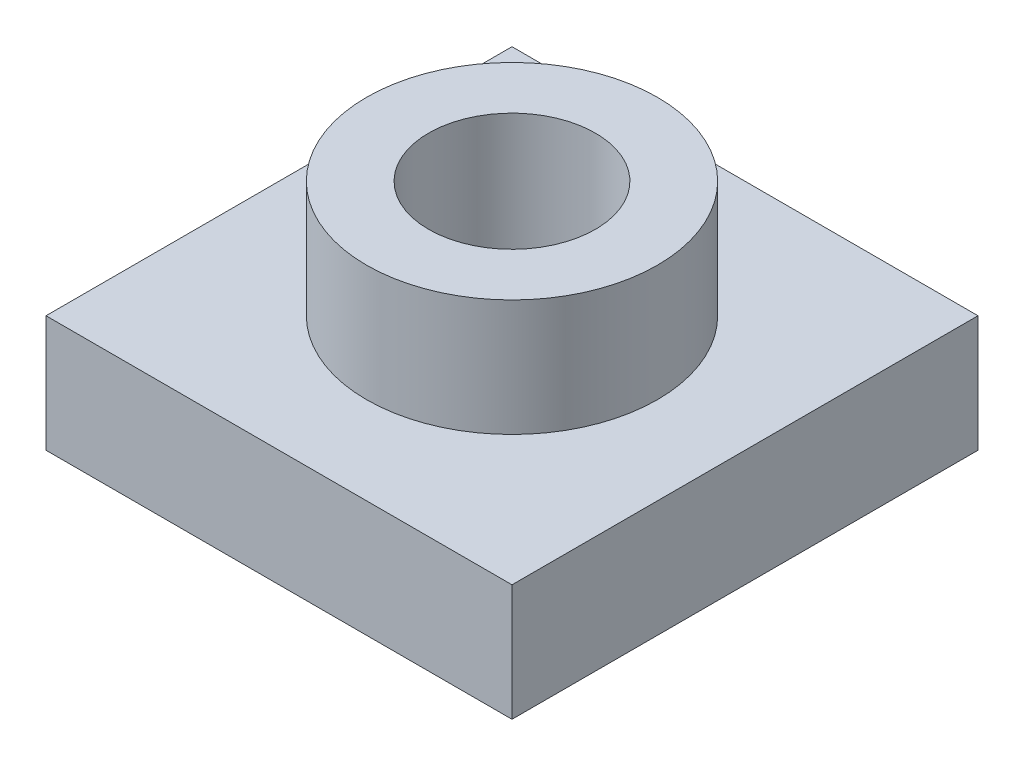
ISO-10303-21;
HEADER;
FILE_DESCRIPTION(('STEP AP214'),'2;1');
FILE_NAME('part.step','',(''),(''),'','','');
FILE_SCHEMA(('AUTOMOTIVE_DESIGN { 1 0 10303 214 1 1 1 1 }'));
ENDSEC;
DATA;
#1=APPLICATION_CONTEXT('core data for automotive mechanical design processes');
#2=APPLICATION_PROTOCOL_DEFINITION('international standard','automotive_design',2000,#1);
#3=PRODUCT_CONTEXT('',#1,'mechanical');
#4=PRODUCT('Part','Part','',(#3));
#5=PRODUCT_RELATED_PRODUCT_CATEGORY('part','',(#4));
#6=PRODUCT_DEFINITION_FORMATION('','',#4);
#7=PRODUCT_DEFINITION_CONTEXT('part definition',#1,'design');
#8=PRODUCT_DEFINITION('design','',#6,#7);
#9=PRODUCT_DEFINITION_SHAPE('','',#8);
#10=(LENGTH_UNIT() NAMED_UNIT(*) SI_UNIT(.MILLI.,.METRE.));
#11=(NAMED_UNIT(*) PLANE_ANGLE_UNIT() SI_UNIT($,.RADIAN.));
#12=(NAMED_UNIT(*) SI_UNIT($,.STERADIAN.) SOLID_ANGLE_UNIT());
#13=UNCERTAINTY_MEASURE_WITH_UNIT(LENGTH_MEASURE(1.E-05),#10,'distance_accuracy_value','');
#14=(GEOMETRIC_REPRESENTATION_CONTEXT(3) GLOBAL_UNCERTAINTY_ASSIGNED_CONTEXT((#13)) GLOBAL_UNIT_ASSIGNED_CONTEXT((#10,
#11,#12)) REPRESENTATION_CONTEXT('',''));
#15=CARTESIAN_POINT('',(0.,0.,0.));
#16=DIRECTION('',(0.,0.,1.));
#17=DIRECTION('',(1.,0.,0.));
#18=AXIS2_PLACEMENT_3D('',#15,#16,#17);
#19=CARTESIAN_POINT('',(0.,12.5,0.));
#20=DIRECTION('',(1.,0.,0.));
#21=DIRECTION('',(0.,0.,-1.));
#22=AXIS2_PLACEMENT_3D('',#19,#20,#21);
#23=PLANE('',#22);
#24=DIRECTION('',(0.,0.,1.));
#25=VECTOR('',#24,1.);
#26=CARTESIAN_POINT('',(0.,0.,0.));
#27=LINE('',#26,#25);
#28=CARTESIAN_POINT('',(0.,0.,-50.));
#29=VERTEX_POINT('',#28);
#30=CARTESIAN_POINT('',(0.,0.,0.));
#31=VERTEX_POINT('',#30);
#32=EDGE_CURVE('E116',#29,#31,#27,.T.);
#33=ORIENTED_EDGE('',*,*,#32,.T.);
#34=DIRECTION('',(0.,-1.,0.));
#35=VECTOR('',#34,1.);
#36=CARTESIAN_POINT('',(0.,12.5,0.));
#37=LINE('',#36,#35);
#38=CARTESIAN_POINT('',(0.,12.5,0.));
#39=VERTEX_POINT('',#38);
#40=EDGE_CURVE('E54',#39,#31,#37,.T.);
#41=ORIENTED_EDGE('',*,*,#40,.F.);
#42=DIRECTION('',(0.,0.,1.));
#43=VECTOR('',#42,1.);
#44=CARTESIAN_POINT('',(0.,12.5,0.));
#45=LINE('',#44,#43);
#46=CARTESIAN_POINT('',(0.,12.5,-50.));
#47=VERTEX_POINT('',#46);
#48=EDGE_CURVE('E98',#47,#39,#45,.T.);
#49=ORIENTED_EDGE('',*,*,#48,.F.);
#50=DIRECTION('',(0.,-1.,0.));
#51=VECTOR('',#50,1.);
#52=CARTESIAN_POINT('',(0.,12.5,-50.));
#53=LINE('',#52,#51);
#54=EDGE_CURVE('E112',#47,#29,#53,.T.);
#55=ORIENTED_EDGE('',*,*,#54,.T.);
#56=EDGE_LOOP('',(#33,#41,#49,#55));
#57=FACE_BOUND('',#56,.T.);
#58=ADVANCED_FACE('F45',(#57),#23,.F.);
#59=CARTESIAN_POINT('',(0.,12.5,0.));
#60=DIRECTION('',(0.,0.,-1.));
#61=DIRECTION('',(-1.,0.,0.));
#62=AXIS2_PLACEMENT_3D('',#59,#60,#61);
#63=PLANE('',#62);
#64=DIRECTION('',(1.,0.,0.));
#65=VECTOR('',#64,1.);
#66=CARTESIAN_POINT('',(0.,0.,0.));
#67=LINE('',#66,#65);
#68=CARTESIAN_POINT('',(50.,0.,0.));
#69=VERTEX_POINT('',#68);
#70=EDGE_CURVE('E104',#31,#69,#67,.T.);
#71=ORIENTED_EDGE('',*,*,#70,.T.);
#72=DIRECTION('',(0.,-1.,0.));
#73=VECTOR('',#72,1.);
#74=CARTESIAN_POINT('',(50.,12.5,0.));
#75=LINE('',#74,#73);
#76=CARTESIAN_POINT('',(50.,12.5,0.));
#77=VERTEX_POINT('',#76);
#78=EDGE_CURVE('E102',#77,#69,#75,.T.);
#79=ORIENTED_EDGE('',*,*,#78,.F.);
#80=DIRECTION('',(1.,0.,0.));
#81=VECTOR('',#80,1.);
#82=CARTESIAN_POINT('',(0.,12.5,0.));
#83=LINE('',#82,#81);
#84=EDGE_CURVE('E93',#39,#77,#83,.T.);
#85=ORIENTED_EDGE('',*,*,#84,.F.);
#86=ORIENTED_EDGE('',*,*,#40,.T.);
#87=EDGE_LOOP('',(#71,#79,#85,#86));
#88=FACE_BOUND('',#87,.T.);
#89=ADVANCED_FACE('F103',(#88),#63,.F.);
#90=CARTESIAN_POINT('',(50.,12.5,0.));
#91=DIRECTION('',(-1.,0.,0.));
#92=DIRECTION('',(0.,0.,1.));
#93=AXIS2_PLACEMENT_3D('',#90,#91,#92);
#94=PLANE('',#93);
#95=DIRECTION('',(0.,0.,-1.));
#96=VECTOR('',#95,1.);
#97=CARTESIAN_POINT('',(50.,0.,0.));
#98=LINE('',#97,#96);
#99=CARTESIAN_POINT('',(50.,0.,-50.));
#100=VERTEX_POINT('',#99);
#101=EDGE_CURVE('E79',#69,#100,#98,.T.);
#102=ORIENTED_EDGE('',*,*,#101,.T.);
#103=DIRECTION('',(0.,-1.,0.));
#104=VECTOR('',#103,1.);
#105=CARTESIAN_POINT('',(50.,12.5,-50.));
#106=LINE('',#105,#104);
#107=CARTESIAN_POINT('',(50.,12.5,-50.));
#108=VERTEX_POINT('',#107);
#109=EDGE_CURVE('E106',#108,#100,#106,.T.);
#110=ORIENTED_EDGE('',*,*,#109,.F.);
#111=DIRECTION('',(0.,0.,-1.));
#112=VECTOR('',#111,1.);
#113=CARTESIAN_POINT('',(50.,12.5,0.));
#114=LINE('',#113,#112);
#115=EDGE_CURVE('E96',#77,#108,#114,.T.);
#116=ORIENTED_EDGE('',*,*,#115,.F.);
#117=ORIENTED_EDGE('',*,*,#78,.T.);
#118=EDGE_LOOP('',(#102,#110,#116,#117));
#119=FACE_BOUND('',#118,.T.);
#120=ADVANCED_FACE('F108',(#119),#94,.F.);
#121=CARTESIAN_POINT('',(0.,12.5,-50.));
#122=DIRECTION('',(0.,0.,1.));
#123=DIRECTION('',(1.,0.,0.));
#124=AXIS2_PLACEMENT_3D('',#121,#122,#123);
#125=PLANE('',#124);
#126=DIRECTION('',(-1.,0.,0.));
#127=VECTOR('',#126,1.);
#128=CARTESIAN_POINT('',(0.,0.,-50.));
#129=LINE('',#128,#127);
#130=EDGE_CURVE('E85',#100,#29,#129,.T.);
#131=ORIENTED_EDGE('',*,*,#130,.T.);
#132=ORIENTED_EDGE('',*,*,#54,.F.);
#133=DIRECTION('',(-1.,0.,0.));
#134=VECTOR('',#133,1.);
#135=CARTESIAN_POINT('',(0.,12.5,-50.));
#136=LINE('',#135,#134);
#137=EDGE_CURVE('E62',#108,#47,#136,.T.);
#138=ORIENTED_EDGE('',*,*,#137,.F.);
#139=ORIENTED_EDGE('',*,*,#109,.T.);
#140=EDGE_LOOP('',(#131,#132,#138,#139));
#141=FACE_BOUND('',#140,.T.);
#142=ADVANCED_FACE('F148',(#141),#125,.F.);
#143=CARTESIAN_POINT('',(0.,12.5,0.));
#144=DIRECTION('',(0.,-1.,0.));
#145=DIRECTION('',(0.,0.,-1.));
#146=AXIS2_PLACEMENT_3D('',#143,#144,#145);
#147=PLANE('',#146);
#148=CARTESIAN_POINT('',(25.,12.5,-25.));
#149=DIRECTION('',(0.,-1.,0.));
#150=DIRECTION('',(0.,0.,-1.));
#151=AXIS2_PLACEMENT_3D('',#148,#149,#150);
#152=CIRCLE('',#151,15.605);
#153=CARTESIAN_POINT('',(25.,12.5,-40.605));
#154=VERTEX_POINT('',#153);
#155=EDGE_CURVE('E11',#154,#154,#152,.F.);
#156=ORIENTED_EDGE('',*,*,#155,.F.);
#157=EDGE_LOOP('',(#156));
#158=FACE_BOUND('',#157,.T.);
#159=ORIENTED_EDGE('',*,*,#48,.T.);
#160=ORIENTED_EDGE('',*,*,#84,.T.);
#161=ORIENTED_EDGE('',*,*,#115,.T.);
#162=ORIENTED_EDGE('',*,*,#137,.T.);
#163=EDGE_LOOP('',(#159,#160,#161,#162));
#164=FACE_BOUND('',#163,.T.);
#165=ADVANCED_FACE('F94',(#158,#164),#147,.F.);
#166=CARTESIAN_POINT('',(0.,0.,0.));
#167=DIRECTION('',(0.,-1.,0.));
#168=DIRECTION('',(0.,0.,-1.));
#169=AXIS2_PLACEMENT_3D('',#166,#167,#168);
#170=PLANE('',#169);
#171=CARTESIAN_POINT('',(25.,0.,-25.));
#172=DIRECTION('',(0.,1.,0.));
#173=DIRECTION('',(0.,0.,1.));
#174=AXIS2_PLACEMENT_3D('',#171,#172,#173);
#175=CIRCLE('',#174,8.95);
#176=CARTESIAN_POINT('',(25.,0.,-16.05));
#177=VERTEX_POINT('',#176);
#178=EDGE_CURVE('E204',#177,#177,#175,.T.);
#179=ORIENTED_EDGE('',*,*,#178,.T.);
#180=EDGE_LOOP('',(#179));
#181=FACE_BOUND('',#180,.T.);
#182=ORIENTED_EDGE('',*,*,#32,.F.);
#183=ORIENTED_EDGE('',*,*,#130,.F.);
#184=ORIENTED_EDGE('',*,*,#101,.F.);
#185=ORIENTED_EDGE('',*,*,#70,.F.);
#186=EDGE_LOOP('',(#182,#183,#184,#185));
#187=FACE_BOUND('',#186,.T.);
#188=ADVANCED_FACE('F134',(#181,#187),#170,.T.);
#189=CARTESIAN_POINT('',(25.,25.,-25.));
#190=DIRECTION('',(0.,1.,0.));
#191=DIRECTION('',(0.,0.,1.));
#192=AXIS2_PLACEMENT_3D('',#189,#190,#191);
#193=PLANE('',#192);
#194=CARTESIAN_POINT('',(25.,25.,-25.));
#195=DIRECTION('',(0.,1.,0.));
#196=DIRECTION('',(0.,0.,1.));
#197=AXIS2_PLACEMENT_3D('',#194,#195,#196);
#198=CIRCLE('',#197,15.605);
#199=CARTESIAN_POINT('',(25.,25.,-9.39499999999999));
#200=VERTEX_POINT('',#199);
#201=EDGE_CURVE('E120',#200,#200,#198,.T.);
#202=ORIENTED_EDGE('',*,*,#201,.T.);
#203=EDGE_LOOP('',(#202));
#204=FACE_BOUND('',#203,.T.);
#205=CARTESIAN_POINT('',(25.,25.,-25.));
#206=DIRECTION('',(0.,1.,0.));
#207=DIRECTION('',(0.,0.,1.));
#208=AXIS2_PLACEMENT_3D('',#205,#206,#207);
#209=CIRCLE('',#208,8.95);
#210=CARTESIAN_POINT('',(25.,25.,-16.05));
#211=VERTEX_POINT('',#210);
#212=EDGE_CURVE('E202',#211,#211,#209,.T.);
#213=ORIENTED_EDGE('',*,*,#212,.F.);
#214=EDGE_LOOP('',(#213));
#215=FACE_BOUND('',#214,.T.);
#216=ADVANCED_FACE('F136',(#204,#215),#193,.T.);
#217=CARTESIAN_POINT('',(25.,25.,-25.));
#218=DIRECTION('',(0.,-1.,0.));
#219=DIRECTION('',(0.,0.,-1.));
#220=AXIS2_PLACEMENT_3D('',#217,#218,#219);
#221=CYLINDRICAL_SURFACE('',#220,15.605);
#222=ORIENTED_EDGE('',*,*,#201,.F.);
#223=EDGE_LOOP('',(#222));
#224=FACE_BOUND('',#223,.T.);
#225=ORIENTED_EDGE('',*,*,#155,.T.);
#226=EDGE_LOOP('',(#225));
#227=FACE_BOUND('',#226,.T.);
#228=ADVANCED_FACE('F144',(#224,#227),#221,.T.);
#229=CARTESIAN_POINT('',(25.,25.,-25.));
#230=DIRECTION('',(0.,-1.,0.));
#231=DIRECTION('',(0.,0.,-1.));
#232=AXIS2_PLACEMENT_3D('',#229,#230,#231);
#233=CYLINDRICAL_SURFACE('',#232,8.95);
#234=ORIENTED_EDGE('',*,*,#212,.T.);
#235=EDGE_LOOP('',(#234));
#236=FACE_BOUND('',#235,.T.);
#237=ORIENTED_EDGE('',*,*,#178,.F.);
#238=EDGE_LOOP('',(#237));
#239=FACE_BOUND('',#238,.T.);
#240=ADVANCED_FACE('F181',(#236,#239),#233,.F.);
#241=CLOSED_SHELL('',(#58,#89,#120,#142,#165,#188,#216,#228,#240));
#242=MANIFOLD_SOLID_BREP('B2',#241);
#243=ADVANCED_BREP_SHAPE_REPRESENTATION('',(#18,#242),#14);
#244=SHAPE_DEFINITION_REPRESENTATION(#9,#243);
ENDSEC;
END-ISO-10303-21;
